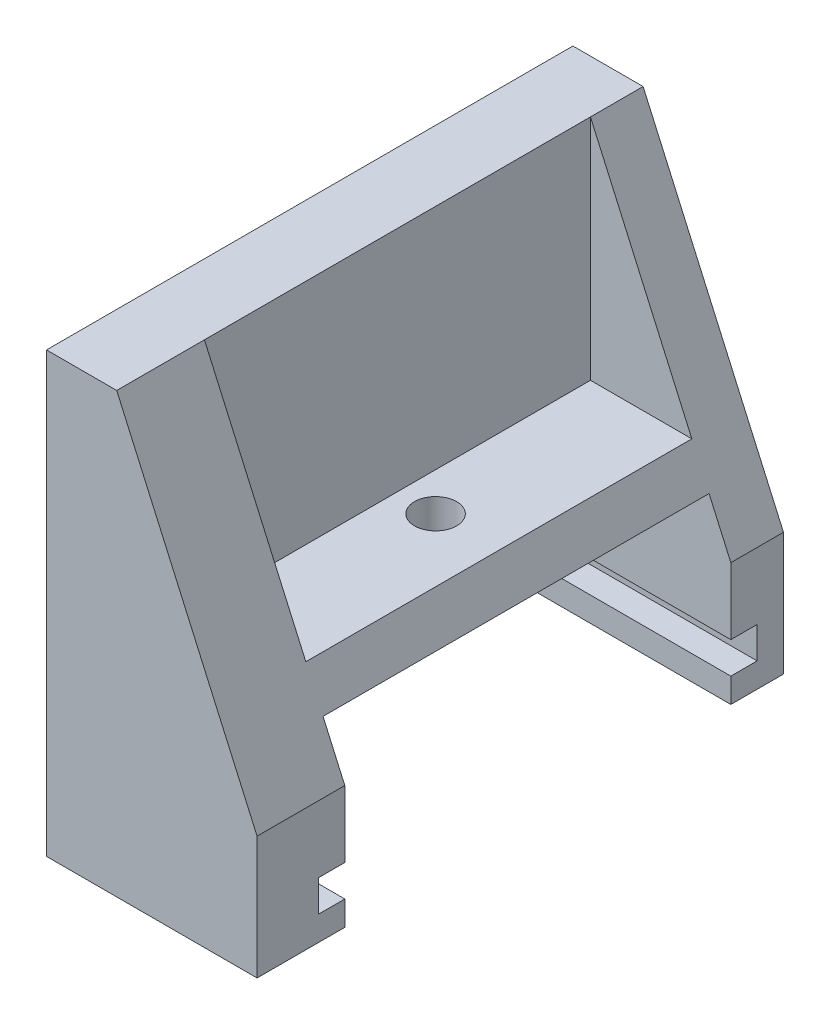
ISO-10303-21;
HEADER;
FILE_DESCRIPTION(('STEP AP214'),'2;1');
FILE_NAME('part.step','',(''),(''),'','','');
FILE_SCHEMA(('AUTOMOTIVE_DESIGN { 1 0 10303 214 1 1 1 1 }'));
ENDSEC;
DATA;
#1=APPLICATION_CONTEXT('core data for automotive mechanical design processes');
#2=APPLICATION_PROTOCOL_DEFINITION('international standard','automotive_design',2000,#1);
#3=PRODUCT_CONTEXT('',#1,'mechanical');
#4=PRODUCT('Part','Part','',(#3));
#5=PRODUCT_RELATED_PRODUCT_CATEGORY('part','',(#4));
#6=PRODUCT_DEFINITION_FORMATION('','',#4);
#7=PRODUCT_DEFINITION_CONTEXT('part definition',#1,'design');
#8=PRODUCT_DEFINITION('design','',#6,#7);
#9=PRODUCT_DEFINITION_SHAPE('','',#8);
#10=(LENGTH_UNIT() NAMED_UNIT(*) SI_UNIT(.MILLI.,.METRE.));
#11=(NAMED_UNIT(*) PLANE_ANGLE_UNIT() SI_UNIT($,.RADIAN.));
#12=(NAMED_UNIT(*) SI_UNIT($,.STERADIAN.) SOLID_ANGLE_UNIT());
#13=UNCERTAINTY_MEASURE_WITH_UNIT(LENGTH_MEASURE(1.E-05),#10,'distance_accuracy_value','');
#14=(GEOMETRIC_REPRESENTATION_CONTEXT(3) GLOBAL_UNCERTAINTY_ASSIGNED_CONTEXT((#13)) GLOBAL_UNIT_ASSIGNED_CONTEXT((#10,
#11,#12)) REPRESENTATION_CONTEXT('',''));
#15=CARTESIAN_POINT('',(0.,0.,0.));
#16=DIRECTION('',(0.,0.,1.));
#17=DIRECTION('',(1.,0.,0.));
#18=AXIS2_PLACEMENT_3D('',#15,#16,#17);
#19=CARTESIAN_POINT('',(12.,-25.,-30.));
#20=DIRECTION('',(1.,0.,0.));
#21=DIRECTION('',(0.,0.,-1.));
#22=AXIS2_PLACEMENT_3D('',#19,#20,#21);
#23=PLANE('',#22);
#24=DIRECTION('',(0.,-1.,0.));
#25=VECTOR('',#24,1.);
#26=CARTESIAN_POINT('',(12.,-25.,-28.5));
#27=LINE('',#26,#25);
#28=CARTESIAN_POINT('',(12.,-21.8,-28.5));
#29=VERTEX_POINT('',#28);
#30=CARTESIAN_POINT('',(12.,-23.6,-28.5));
#31=VERTEX_POINT('',#30);
#32=EDGE_CURVE('E361',#29,#31,#27,.T.);
#33=ORIENTED_EDGE('',*,*,#32,.T.);
#34=DIRECTION('',(0.,0.,1.));
#35=VECTOR('',#34,1.);
#36=CARTESIAN_POINT('',(12.,-23.6,-30.));
#37=LINE('',#36,#35);
#38=CARTESIAN_POINT('',(12.,-23.6,-27.));
#39=VERTEX_POINT('',#38);
#40=EDGE_CURVE('E364',#31,#39,#37,.T.);
#41=ORIENTED_EDGE('',*,*,#40,.T.);
#42=DIRECTION('',(0.,1.,0.));
#43=VECTOR('',#42,1.);
#44=CARTESIAN_POINT('',(12.,-25.,-27.));
#45=LINE('',#44,#43);
#46=CARTESIAN_POINT('',(12.,-25.,-27.));
#47=VERTEX_POINT('',#46);
#48=EDGE_CURVE('E282',#47,#39,#45,.T.);
#49=ORIENTED_EDGE('',*,*,#48,.F.);
#50=DIRECTION('',(0.,0.,1.));
#51=VECTOR('',#50,1.);
#52=CARTESIAN_POINT('',(12.,-25.,-30.));
#53=LINE('',#52,#51);
#54=CARTESIAN_POINT('',(12.,-25.,-30.));
#55=VERTEX_POINT('',#54);
#56=EDGE_CURVE('E224',#55,#47,#53,.T.);
#57=ORIENTED_EDGE('',*,*,#56,.F.);
#58=DIRECTION('',(0.,1.,0.));
#59=VECTOR('',#58,1.);
#60=CARTESIAN_POINT('',(12.,-25.,-30.));
#61=LINE('',#60,#59);
#62=CARTESIAN_POINT('',(12.,-18.,-30.));
#63=VERTEX_POINT('',#62);
#64=EDGE_CURVE('E296',#55,#63,#61,.T.);
#65=ORIENTED_EDGE('',*,*,#64,.T.);
#66=DIRECTION('',(0.,0.,1.));
#67=VECTOR('',#66,1.);
#68=CARTESIAN_POINT('',(12.,-18.,-30.));
#69=LINE('',#68,#67);
#70=CARTESIAN_POINT('',(12.,-18.,-27.));
#71=VERTEX_POINT('',#70);
#72=EDGE_CURVE('E216',#63,#71,#69,.T.);
#73=ORIENTED_EDGE('',*,*,#72,.T.);
#74=CARTESIAN_POINT('',(12.,-21.8,-27.));
#75=VERTEX_POINT('',#74);
#76=EDGE_CURVE('E281',#75,#71,#45,.T.);
#77=ORIENTED_EDGE('',*,*,#76,.F.);
#78=DIRECTION('',(0.,0.,-1.));
#79=VECTOR('',#78,1.);
#80=CARTESIAN_POINT('',(12.,-21.8,-30.));
#81=LINE('',#80,#79);
#82=EDGE_CURVE('E60',#75,#29,#81,.T.);
#83=ORIENTED_EDGE('',*,*,#82,.T.);
#84=EDGE_LOOP('',(#33,#41,#49,#57,#65,#73,#77,#83));
#85=FACE_BOUND('',#84,.T.);
#86=ADVANCED_FACE('F37',(#85),#23,.T.);
#87=CARTESIAN_POINT('',(0.,0.,-30.));
#88=DIRECTION('',(-1.,0.,0.));
#89=DIRECTION('',(0.,0.,1.));
#90=AXIS2_PLACEMENT_3D('',#87,#88,#89);
#91=PLANE('',#90);
#92=DIRECTION('',(0.,-1.,0.));
#93=VECTOR('',#92,1.);
#94=CARTESIAN_POINT('',(0.,-15.2079971845944,-27.));
#95=LINE('',#94,#93);
#96=CARTESIAN_POINT('',(0.,-23.6,-27.));
#97=VERTEX_POINT('',#96);
#98=CARTESIAN_POINT('',(0.,-25.,-27.));
#99=VERTEX_POINT('',#98);
#100=EDGE_CURVE('E258',#97,#99,#95,.T.);
#101=ORIENTED_EDGE('',*,*,#100,.F.);
#102=DIRECTION('',(0.,0.,-1.));
#103=VECTOR('',#102,1.);
#104=CARTESIAN_POINT('',(0.,-23.6,-27.));
#105=LINE('',#104,#103);
#106=CARTESIAN_POINT('',(0.,-23.6,-28.5));
#107=VERTEX_POINT('',#106);
#108=EDGE_CURVE('E371',#97,#107,#105,.T.);
#109=ORIENTED_EDGE('',*,*,#108,.T.);
#110=DIRECTION('',(0.,1.,0.));
#111=VECTOR('',#110,1.);
#112=CARTESIAN_POINT('',(0.,-21.8,-28.5));
#113=LINE('',#112,#111);
#114=CARTESIAN_POINT('',(0.,-21.8,-28.5));
#115=VERTEX_POINT('',#114);
#116=EDGE_CURVE('E250',#107,#115,#113,.T.);
#117=ORIENTED_EDGE('',*,*,#116,.T.);
#118=DIRECTION('',(0.,0.,1.));
#119=VECTOR('',#118,1.);
#120=CARTESIAN_POINT('',(0.,-21.8,-27.));
#121=LINE('',#120,#119);
#122=CARTESIAN_POINT('',(0.,-21.8,-27.));
#123=VERTEX_POINT('',#122);
#124=EDGE_CURVE('E237',#115,#123,#121,.T.);
#125=ORIENTED_EDGE('',*,*,#124,.T.);
#126=CARTESIAN_POINT('',(0.,-15.2079971845944,-27.));
#127=VERTEX_POINT('',#126);
#128=EDGE_CURVE('E247',#127,#123,#95,.T.);
#129=ORIENTED_EDGE('',*,*,#128,.F.);
#130=DIRECTION('',(0.,0.,1.));
#131=VECTOR('',#130,1.);
#132=CARTESIAN_POINT('',(0.,-15.2079971845944,-27.));
#133=LINE('',#132,#131);
#134=CARTESIAN_POINT('',(0.,-15.2079971845944,-5.));
#135=VERTEX_POINT('',#134);
#136=EDGE_CURVE('E261',#127,#135,#133,.T.);
#137=ORIENTED_EDGE('',*,*,#136,.T.);
#138=DIRECTION('',(0.,-1.,0.));
#139=VECTOR('',#138,1.);
#140=CARTESIAN_POINT('',(0.,-15.2079971845944,-5.));
#141=LINE('',#140,#139);
#142=CARTESIAN_POINT('',(0.,-21.8,-5.));
#143=VERTEX_POINT('',#142);
#144=EDGE_CURVE('E340',#135,#143,#141,.T.);
#145=ORIENTED_EDGE('',*,*,#144,.T.);
#146=DIRECTION('',(0.,0.,-1.));
#147=VECTOR('',#146,1.);
#148=CARTESIAN_POINT('',(0.,-21.8,-5.));
#149=LINE('',#148,#147);
#150=CARTESIAN_POINT('',(0.,-21.8,-3.5));
#151=VERTEX_POINT('',#150);
#152=EDGE_CURVE('E352',#151,#143,#149,.T.);
#153=ORIENTED_EDGE('',*,*,#152,.F.);
#154=DIRECTION('',(0.,1.,0.));
#155=VECTOR('',#154,1.);
#156=CARTESIAN_POINT('',(0.,-21.8,-3.5));
#157=LINE('',#156,#155);
#158=CARTESIAN_POINT('',(0.,-23.6,-3.5));
#159=VERTEX_POINT('',#158);
#160=EDGE_CURVE('E355',#159,#151,#157,.T.);
#161=ORIENTED_EDGE('',*,*,#160,.F.);
#162=DIRECTION('',(0.,0.,1.));
#163=VECTOR('',#162,1.);
#164=CARTESIAN_POINT('',(0.,-23.6,-5.));
#165=LINE('',#164,#163);
#166=CARTESIAN_POINT('',(0.,-23.6,-5.));
#167=VERTEX_POINT('',#166);
#168=EDGE_CURVE('E358',#167,#159,#165,.T.);
#169=ORIENTED_EDGE('',*,*,#168,.F.);
#170=CARTESIAN_POINT('',(0.,-25.,-5.));
#171=VERTEX_POINT('',#170);
#172=EDGE_CURVE('E341',#167,#171,#141,.T.);
#173=ORIENTED_EDGE('',*,*,#172,.T.);
#174=DIRECTION('',(0.,0.,1.));
#175=VECTOR('',#174,1.);
#176=CARTESIAN_POINT('',(0.,-25.,-30.));
#177=LINE('',#176,#175);
#178=CARTESIAN_POINT('',(0.,-25.,0.));
#179=VERTEX_POINT('',#178);
#180=EDGE_CURVE('E231',#171,#179,#177,.T.);
#181=ORIENTED_EDGE('',*,*,#180,.T.);
#182=DIRECTION('',(0.,-1.,0.));
#183=VECTOR('',#182,1.);
#184=CARTESIAN_POINT('',(0.,0.,0.));
#185=LINE('',#184,#183);
#186=CARTESIAN_POINT('',(0.,0.,0.));
#187=VERTEX_POINT('',#186);
#188=EDGE_CURVE('E302',#187,#179,#185,.T.);
#189=ORIENTED_EDGE('',*,*,#188,.F.);
#190=DIRECTION('',(0.,0.,1.));
#191=VECTOR('',#190,1.);
#192=CARTESIAN_POINT('',(0.,0.,-30.));
#193=LINE('',#192,#191);
#194=CARTESIAN_POINT('',(0.,0.,-30.));
#195=VERTEX_POINT('',#194);
#196=EDGE_CURVE('E232',#195,#187,#193,.T.);
#197=ORIENTED_EDGE('',*,*,#196,.F.);
#198=DIRECTION('',(0.,-1.,0.));
#199=VECTOR('',#198,1.);
#200=CARTESIAN_POINT('',(0.,0.,-30.));
#201=LINE('',#200,#199);
#202=CARTESIAN_POINT('',(0.,-25.,-30.));
#203=VERTEX_POINT('',#202);
#204=EDGE_CURVE('E290',#195,#203,#201,.T.);
#205=ORIENTED_EDGE('',*,*,#204,.T.);
#206=EDGE_CURVE('E228',#203,#99,#177,.T.);
#207=ORIENTED_EDGE('',*,*,#206,.T.);
#208=EDGE_LOOP('',(#101,#109,#117,#125,#129,#137,#145,#153,#161,#169,#173,#181,#189,#197,#205,#207));
#209=FACE_BOUND('',#208,.T.);
#210=ADVANCED_FACE('F245',(#209),#91,.T.);
#211=CARTESIAN_POINT('',(15.,-15.2079971845944,-27.));
#212=DIRECTION('',(0.,0.,-1.));
#213=DIRECTION('',(0.,1.,0.));
#214=AXIS2_PLACEMENT_3D('',#211,#212,#213);
#215=PLANE('',#214);
#216=DIRECTION('',(1.,0.,0.));
#217=VECTOR('',#216,1.);
#218=CARTESIAN_POINT('',(15.,-23.6,-27.));
#219=LINE('',#218,#217);
#220=EDGE_CURVE('E11',#97,#39,#219,.T.);
#221=ORIENTED_EDGE('',*,*,#220,.F.);
#222=ORIENTED_EDGE('',*,*,#100,.T.);
#223=DIRECTION('',(1.,0.,0.));
#224=VECTOR('',#223,1.);
#225=CARTESIAN_POINT('',(0.,-25.,-27.));
#226=LINE('',#225,#224);
#227=EDGE_CURVE('E279',#99,#47,#226,.T.);
#228=ORIENTED_EDGE('',*,*,#227,.T.);
#229=ORIENTED_EDGE('',*,*,#48,.T.);
#230=EDGE_LOOP('',(#221,#222,#228,#229));
#231=FACE_BOUND('',#230,.T.);
#232=ADVANCED_FACE('F411',(#231),#215,.F.);
#233=DIRECTION('',(-1.,0.,0.));
#234=VECTOR('',#233,1.);
#235=CARTESIAN_POINT('',(15.,-21.8,-27.));
#236=LINE('',#235,#234);
#237=EDGE_CURVE('E45',#75,#123,#236,.T.);
#238=ORIENTED_EDGE('',*,*,#237,.F.);
#239=ORIENTED_EDGE('',*,*,#76,.T.);
#240=DIRECTION('',(-0.406138466053448,0.913811548620257,0.));
#241=VECTOR('',#240,1.);
#242=CARTESIAN_POINT('',(12.,-18.,-27.));
#243=LINE('',#242,#241);
#244=CARTESIAN_POINT('',(10.7591098598198,-15.2079971845944,-27.));
#245=VERTEX_POINT('',#244);
#246=EDGE_CURVE('E285',#71,#245,#243,.T.);
#247=ORIENTED_EDGE('',*,*,#246,.T.);
#248=DIRECTION('',(-1.,0.,0.));
#249=VECTOR('',#248,1.);
#250=CARTESIAN_POINT('',(15.,-15.2079971845944,-27.));
#251=LINE('',#250,#249);
#252=EDGE_CURVE('E255',#245,#127,#251,.T.);
#253=ORIENTED_EDGE('',*,*,#252,.T.);
#254=ORIENTED_EDGE('',*,*,#128,.T.);
#255=EDGE_LOOP('',(#238,#239,#247,#253,#254));
#256=FACE_BOUND('',#255,.T.);
#257=ADVANCED_FACE('F253',(#256),#215,.F.);
#258=CARTESIAN_POINT('',(15.,-15.2079971845944,-5.));
#259=DIRECTION('',(0.,0.,-1.));
#260=DIRECTION('',(-1.,0.,0.));
#261=AXIS2_PLACEMENT_3D('',#258,#259,#260);
#262=PLANE('',#261);
#263=DIRECTION('',(1.,0.,0.));
#264=VECTOR('',#263,1.);
#265=CARTESIAN_POINT('',(15.,-21.8,-5.));
#266=LINE('',#265,#264);
#267=CARTESIAN_POINT('',(12.,-21.8,-5.));
#268=VERTEX_POINT('',#267);
#269=EDGE_CURVE('E214',#143,#268,#266,.T.);
#270=ORIENTED_EDGE('',*,*,#269,.F.);
#271=ORIENTED_EDGE('',*,*,#144,.F.);
#272=DIRECTION('',(-1.,0.,0.));
#273=VECTOR('',#272,1.);
#274=CARTESIAN_POINT('',(15.,-15.2079971845944,-5.));
#275=LINE('',#274,#273);
#276=CARTESIAN_POINT('',(10.7591098598198,-15.2079971845944,-5.));
#277=VERTEX_POINT('',#276);
#278=EDGE_CURVE('E257',#277,#135,#275,.T.);
#279=ORIENTED_EDGE('',*,*,#278,.F.);
#280=DIRECTION('',(-0.406138466053448,0.913811548620257,0.));
#281=VECTOR('',#280,1.);
#282=CARTESIAN_POINT('',(12.,-18.,-5.));
#283=LINE('',#282,#281);
#284=CARTESIAN_POINT('',(12.,-18.,-5.));
#285=VERTEX_POINT('',#284);
#286=EDGE_CURVE('E273',#285,#277,#283,.T.);
#287=ORIENTED_EDGE('',*,*,#286,.F.);
#288=DIRECTION('',(0.,1.,0.));
#289=VECTOR('',#288,1.);
#290=CARTESIAN_POINT('',(12.,-25.,-5.));
#291=LINE('',#290,#289);
#292=EDGE_CURVE('E269',#268,#285,#291,.T.);
#293=ORIENTED_EDGE('',*,*,#292,.F.);
#294=EDGE_LOOP('',(#270,#271,#279,#287,#293));
#295=FACE_BOUND('',#294,.T.);
#296=ADVANCED_FACE('F334',(#295),#262,.T.);
#297=DIRECTION('',(0.,0.,1.));
#298=VECTOR('',#297,1.);
#299=CARTESIAN_POINT('',(12.,-21.8,-30.));
#300=LINE('',#299,#298);
#301=CARTESIAN_POINT('',(12.,-21.8,-3.5));
#302=VERTEX_POINT('',#301);
#303=EDGE_CURVE('E330',#268,#302,#300,.T.);
#304=ORIENTED_EDGE('',*,*,#303,.F.);
#305=ORIENTED_EDGE('',*,*,#292,.T.);
#306=CARTESIAN_POINT('',(12.,-18.,0.));
#307=VERTEX_POINT('',#306);
#308=EDGE_CURVE('E223',#285,#307,#69,.T.);
#309=ORIENTED_EDGE('',*,*,#308,.T.);
#310=DIRECTION('',(0.,1.,0.));
#311=VECTOR('',#310,1.);
#312=CARTESIAN_POINT('',(12.,-25.,0.));
#313=LINE('',#312,#311);
#314=CARTESIAN_POINT('',(12.,-25.,0.));
#315=VERTEX_POINT('',#314);
#316=EDGE_CURVE('E307',#315,#307,#313,.T.);
#317=ORIENTED_EDGE('',*,*,#316,.F.);
#318=CARTESIAN_POINT('',(12.,-25.,-5.));
#319=VERTEX_POINT('',#318);
#320=EDGE_CURVE('E227',#319,#315,#53,.T.);
#321=ORIENTED_EDGE('',*,*,#320,.F.);
#322=CARTESIAN_POINT('',(12.,-23.6,-5.));
#323=VERTEX_POINT('',#322);
#324=EDGE_CURVE('E270',#319,#323,#291,.T.);
#325=ORIENTED_EDGE('',*,*,#324,.T.);
#326=DIRECTION('',(0.,0.,-1.));
#327=VECTOR('',#326,1.);
#328=CARTESIAN_POINT('',(12.,-23.6,-30.));
#329=LINE('',#328,#327);
#330=CARTESIAN_POINT('',(12.,-23.6,-3.5));
#331=VERTEX_POINT('',#330);
#332=EDGE_CURVE('E347',#331,#323,#329,.T.);
#333=ORIENTED_EDGE('',*,*,#332,.F.);
#334=DIRECTION('',(0.,-1.,0.));
#335=VECTOR('',#334,1.);
#336=CARTESIAN_POINT('',(12.,-25.,-3.5));
#337=LINE('',#336,#335);
#338=EDGE_CURVE('E343',#302,#331,#337,.T.);
#339=ORIENTED_EDGE('',*,*,#338,.F.);
#340=EDGE_LOOP('',(#304,#305,#309,#317,#321,#325,#333,#339));
#341=FACE_BOUND('',#340,.T.);
#342=ADVANCED_FACE('F326',(#341),#23,.T.);
#343=CARTESIAN_POINT('',(0.,-25.,-30.));
#344=DIRECTION('',(0.,-1.,0.));
#345=DIRECTION('',(0.,0.,-1.));
#346=AXIS2_PLACEMENT_3D('',#343,#344,#345);
#347=PLANE('',#346);
#348=ORIENTED_EDGE('',*,*,#180,.F.);
#349=DIRECTION('',(1.,0.,0.));
#350=VECTOR('',#349,1.);
#351=CARTESIAN_POINT('',(0.,-25.,-5.));
#352=LINE('',#351,#350);
#353=EDGE_CURVE('E265',#171,#319,#352,.T.);
#354=ORIENTED_EDGE('',*,*,#353,.T.);
#355=ORIENTED_EDGE('',*,*,#320,.T.);
#356=DIRECTION('',(1.,0.,0.));
#357=VECTOR('',#356,1.);
#358=CARTESIAN_POINT('',(0.,-25.,0.));
#359=LINE('',#358,#357);
#360=EDGE_CURVE('E305',#179,#315,#359,.T.);
#361=ORIENTED_EDGE('',*,*,#360,.F.);
#362=EDGE_LOOP('',(#348,#354,#355,#361));
#363=FACE_BOUND('',#362,.T.);
#364=ADVANCED_FACE('F321',(#363),#347,.T.);
#365=CARTESIAN_POINT('',(4.,0.,-30.));
#366=DIRECTION('',(0.,1.,0.));
#367=DIRECTION('',(-1.,0.,0.));
#368=AXIS2_PLACEMENT_3D('',#365,#366,#367);
#369=PLANE('',#368);
#370=DIRECTION('',(-1.,0.,0.));
#371=VECTOR('',#370,1.);
#372=CARTESIAN_POINT('',(4.,0.,0.));
#373=LINE('',#372,#371);
#374=CARTESIAN_POINT('',(4.,0.,0.));
#375=VERTEX_POINT('',#374);
#376=EDGE_CURVE('E287',#375,#187,#373,.T.);
#377=ORIENTED_EDGE('',*,*,#376,.F.);
#378=DIRECTION('',(0.,0.,1.));
#379=VECTOR('',#378,1.);
#380=CARTESIAN_POINT('',(4.,0.,-30.));
#381=LINE('',#380,#379);
#382=CARTESIAN_POINT('',(4.,0.,-5.));
#383=VERTEX_POINT('',#382);
#384=EDGE_CURVE('E206',#383,#375,#381,.T.);
#385=ORIENTED_EDGE('',*,*,#384,.F.);
#386=DIRECTION('',(0.,0.,1.));
#387=VECTOR('',#386,1.);
#388=CARTESIAN_POINT('',(4.,0.,-27.));
#389=LINE('',#388,#387);
#390=CARTESIAN_POINT('',(4.,0.,-27.));
#391=VERTEX_POINT('',#390);
#392=EDGE_CURVE('E184',#391,#383,#389,.T.);
#393=ORIENTED_EDGE('',*,*,#392,.F.);
#394=CARTESIAN_POINT('',(4.,0.,-30.));
#395=VERTEX_POINT('',#394);
#396=EDGE_CURVE('E204',#395,#391,#381,.T.);
#397=ORIENTED_EDGE('',*,*,#396,.F.);
#398=DIRECTION('',(-1.,0.,0.));
#399=VECTOR('',#398,1.);
#400=CARTESIAN_POINT('',(4.,0.,-30.));
#401=LINE('',#400,#399);
#402=EDGE_CURVE('E288',#395,#195,#401,.T.);
#403=ORIENTED_EDGE('',*,*,#402,.T.);
#404=ORIENTED_EDGE('',*,*,#196,.T.);
#405=EDGE_LOOP('',(#377,#385,#393,#397,#403,#404));
#406=FACE_BOUND('',#405,.T.);
#407=ADVANCED_FACE('F39',(#406),#369,.T.);
#408=CARTESIAN_POINT('',(12.,-18.,-30.));
#409=DIRECTION('',(0.913811548620257,0.406138466053448,0.));
#410=DIRECTION('',(-0.406138466053448,0.913811548620257,0.));
#411=AXIS2_PLACEMENT_3D('',#408,#409,#410);
#412=PLANE('',#411);
#413=DIRECTION('',(-0.406138466053448,0.913811548620257,0.));
#414=VECTOR('',#413,1.);
#415=CARTESIAN_POINT('',(9.77777777777778,-13.,-27.));
#416=LINE('',#415,#414);
#417=CARTESIAN_POINT('',(9.77777777777778,-13.,-27.));
#418=VERTEX_POINT('',#417);
#419=EDGE_CURVE('E191',#418,#391,#416,.T.);
#420=ORIENTED_EDGE('',*,*,#419,.F.);
#421=DIRECTION('',(0.,0.,1.));
#422=VECTOR('',#421,1.);
#423=CARTESIAN_POINT('',(9.77777777777778,-13.,-27.));
#424=LINE('',#423,#422);
#425=CARTESIAN_POINT('',(9.77777777777778,-13.,-5.));
#426=VERTEX_POINT('',#425);
#427=EDGE_CURVE('E251',#418,#426,#424,.T.);
#428=ORIENTED_EDGE('',*,*,#427,.T.);
#429=DIRECTION('',(-0.406138466053448,0.913811548620257,0.));
#430=VECTOR('',#429,1.);
#431=CARTESIAN_POINT('',(9.77777777777778,-13.,-5.));
#432=LINE('',#431,#430);
#433=EDGE_CURVE('E315',#426,#383,#432,.T.);
#434=ORIENTED_EDGE('',*,*,#433,.T.);
#435=ORIENTED_EDGE('',*,*,#384,.T.);
#436=DIRECTION('',(-0.406138466053448,0.913811548620257,0.));
#437=VECTOR('',#436,1.);
#438=CARTESIAN_POINT('',(12.,-18.,0.));
#439=LINE('',#438,#437);
#440=EDGE_CURVE('E219',#307,#375,#439,.T.);
#441=ORIENTED_EDGE('',*,*,#440,.F.);
#442=ORIENTED_EDGE('',*,*,#308,.F.);
#443=ORIENTED_EDGE('',*,*,#286,.T.);
#444=DIRECTION('',(0.,0.,-1.));
#445=VECTOR('',#444,1.);
#446=CARTESIAN_POINT('',(10.7591098598198,-15.2079971845944,-30.));
#447=LINE('',#446,#445);
#448=EDGE_CURVE('E276',#277,#245,#447,.T.);
#449=ORIENTED_EDGE('',*,*,#448,.T.);
#450=ORIENTED_EDGE('',*,*,#246,.F.);
#451=ORIENTED_EDGE('',*,*,#72,.F.);
#452=DIRECTION('',(-0.406138466053448,0.913811548620257,0.));
#453=VECTOR('',#452,1.);
#454=CARTESIAN_POINT('',(12.,-18.,-30.));
#455=LINE('',#454,#453);
#456=EDGE_CURVE('E211',#63,#395,#455,.T.);
#457=ORIENTED_EDGE('',*,*,#456,.T.);
#458=ORIENTED_EDGE('',*,*,#396,.T.);
#459=EDGE_LOOP('',(#420,#428,#434,#435,#441,#442,#443,#449,#450,#451,#457,#458));
#460=FACE_BOUND('',#459,.T.);
#461=ADVANCED_FACE('F209',(#460),#412,.T.);
#462=ORIENTED_EDGE('',*,*,#227,.F.);
#463=ORIENTED_EDGE('',*,*,#206,.F.);
#464=DIRECTION('',(1.,0.,0.));
#465=VECTOR('',#464,1.);
#466=CARTESIAN_POINT('',(0.,-25.,-30.));
#467=LINE('',#466,#465);
#468=EDGE_CURVE('E293',#203,#55,#467,.T.);
#469=ORIENTED_EDGE('',*,*,#468,.T.);
#470=ORIENTED_EDGE('',*,*,#56,.T.);
#471=EDGE_LOOP('',(#462,#463,#469,#470));
#472=FACE_BOUND('',#471,.T.);
#473=ADVANCED_FACE('F419',(#472),#347,.T.);
#474=CARTESIAN_POINT('',(0.,0.,-30.));
#475=DIRECTION('',(0.,0.,1.));
#476=DIRECTION('',(1.,0.,0.));
#477=AXIS2_PLACEMENT_3D('',#474,#475,#476);
#478=PLANE('',#477);
#479=ORIENTED_EDGE('',*,*,#402,.F.);
#480=ORIENTED_EDGE('',*,*,#456,.F.);
#481=ORIENTED_EDGE('',*,*,#64,.F.);
#482=ORIENTED_EDGE('',*,*,#468,.F.);
#483=ORIENTED_EDGE('',*,*,#204,.F.);
#484=EDGE_LOOP('',(#479,#480,#481,#482,#483));
#485=FACE_BOUND('',#484,.T.);
#486=ADVANCED_FACE('F469',(#485),#478,.F.);
#487=CARTESIAN_POINT('',(0.,0.,0.));
#488=DIRECTION('',(0.,0.,1.));
#489=DIRECTION('',(1.,0.,0.));
#490=AXIS2_PLACEMENT_3D('',#487,#488,#489);
#491=PLANE('',#490);
#492=ORIENTED_EDGE('',*,*,#376,.T.);
#493=ORIENTED_EDGE('',*,*,#188,.T.);
#494=ORIENTED_EDGE('',*,*,#360,.T.);
#495=ORIENTED_EDGE('',*,*,#316,.T.);
#496=ORIENTED_EDGE('',*,*,#440,.T.);
#497=EDGE_LOOP('',(#492,#493,#494,#495,#496));
#498=FACE_BOUND('',#497,.T.);
#499=ADVANCED_FACE('F313',(#498),#491,.T.);
#500=CARTESIAN_POINT('',(15.,-15.2079971845944,-27.));
#501=DIRECTION('',(0.,-1.,0.));
#502=DIRECTION('',(0.,0.,-1.));
#503=AXIS2_PLACEMENT_3D('',#500,#501,#502);
#504=PLANE('',#503);
#505=CARTESIAN_POINT('',(6.17275319657275,-15.2079971845944,-16.));
#506=DIRECTION('',(0.,-1.,0.));
#507=DIRECTION('',(0.,0.,-1.));
#508=AXIS2_PLACEMENT_3D('',#505,#506,#507);
#509=CIRCLE('',#508,1.2);
#510=CARTESIAN_POINT('',(6.17275319657275,-15.2079971845944,-17.2));
#511=VERTEX_POINT('',#510);
#512=EDGE_CURVE('E381',#511,#511,#509,.T.);
#513=ORIENTED_EDGE('',*,*,#512,.F.);
#514=EDGE_LOOP('',(#513));
#515=FACE_BOUND('',#514,.T.);
#516=ORIENTED_EDGE('',*,*,#278,.T.);
#517=ORIENTED_EDGE('',*,*,#136,.F.);
#518=ORIENTED_EDGE('',*,*,#252,.F.);
#519=ORIENTED_EDGE('',*,*,#448,.F.);
#520=EDGE_LOOP('',(#516,#517,#518,#519));
#521=FACE_BOUND('',#520,.T.);
#522=ADVANCED_FACE('F338',(#515,#521),#504,.T.);
#523=DIRECTION('',(-1.,0.,0.));
#524=VECTOR('',#523,1.);
#525=CARTESIAN_POINT('',(15.,-23.6,-5.));
#526=LINE('',#525,#524);
#527=EDGE_CURVE('E212',#323,#167,#526,.T.);
#528=ORIENTED_EDGE('',*,*,#527,.F.);
#529=ORIENTED_EDGE('',*,*,#324,.F.);
#530=ORIENTED_EDGE('',*,*,#353,.F.);
#531=ORIENTED_EDGE('',*,*,#172,.F.);
#532=EDGE_LOOP('',(#528,#529,#530,#531));
#533=FACE_BOUND('',#532,.T.);
#534=ADVANCED_FACE('F421',(#533),#262,.T.);
#535=CARTESIAN_POINT('',(15.,-21.8,-5.));
#536=DIRECTION('',(0.,1.,0.));
#537=DIRECTION('',(0.,0.,1.));
#538=AXIS2_PLACEMENT_3D('',#535,#536,#537);
#539=PLANE('',#538);
#540=ORIENTED_EDGE('',*,*,#303,.T.);
#541=DIRECTION('',(-1.,0.,0.));
#542=VECTOR('',#541,1.);
#543=CARTESIAN_POINT('',(15.,-21.8,-3.5));
#544=LINE('',#543,#542);
#545=EDGE_CURVE('E349',#302,#151,#544,.T.);
#546=ORIENTED_EDGE('',*,*,#545,.T.);
#547=ORIENTED_EDGE('',*,*,#152,.T.);
#548=ORIENTED_EDGE('',*,*,#269,.T.);
#549=EDGE_LOOP('',(#540,#546,#547,#548));
#550=FACE_BOUND('',#549,.T.);
#551=ADVANCED_FACE('F429',(#550),#539,.F.);
#552=CARTESIAN_POINT('',(15.,-21.8,-3.5));
#553=DIRECTION('',(0.,0.,1.));
#554=DIRECTION('',(0.,-1.,0.));
#555=AXIS2_PLACEMENT_3D('',#552,#553,#554);
#556=PLANE('',#555);
#557=ORIENTED_EDGE('',*,*,#338,.T.);
#558=DIRECTION('',(-1.,0.,0.));
#559=VECTOR('',#558,1.);
#560=CARTESIAN_POINT('',(15.,-23.6,-3.5));
#561=LINE('',#560,#559);
#562=EDGE_CURVE('E350',#331,#159,#561,.T.);
#563=ORIENTED_EDGE('',*,*,#562,.T.);
#564=ORIENTED_EDGE('',*,*,#160,.T.);
#565=ORIENTED_EDGE('',*,*,#545,.F.);
#566=EDGE_LOOP('',(#557,#563,#564,#565));
#567=FACE_BOUND('',#566,.T.);
#568=ADVANCED_FACE('F435',(#567),#556,.F.);
#569=CARTESIAN_POINT('',(15.,-23.6,-5.));
#570=DIRECTION('',(0.,-1.,0.));
#571=DIRECTION('',(0.,0.,-1.));
#572=AXIS2_PLACEMENT_3D('',#569,#570,#571);
#573=PLANE('',#572);
#574=ORIENTED_EDGE('',*,*,#332,.T.);
#575=ORIENTED_EDGE('',*,*,#527,.T.);
#576=ORIENTED_EDGE('',*,*,#168,.T.);
#577=ORIENTED_EDGE('',*,*,#562,.F.);
#578=EDGE_LOOP('',(#574,#575,#576,#577));
#579=FACE_BOUND('',#578,.T.);
#580=ADVANCED_FACE('F445',(#579),#573,.F.);
#581=CARTESIAN_POINT('',(15.,-23.6,-27.));
#582=DIRECTION('',(0.,1.,0.));
#583=DIRECTION('',(0.,0.,1.));
#584=AXIS2_PLACEMENT_3D('',#581,#582,#583);
#585=PLANE('',#584);
#586=DIRECTION('',(-1.,0.,0.));
#587=VECTOR('',#586,1.);
#588=CARTESIAN_POINT('',(15.,-23.6,-28.5));
#589=LINE('',#588,#587);
#590=EDGE_CURVE('E368',#31,#107,#589,.T.);
#591=ORIENTED_EDGE('',*,*,#590,.T.);
#592=ORIENTED_EDGE('',*,*,#108,.F.);
#593=ORIENTED_EDGE('',*,*,#220,.T.);
#594=ORIENTED_EDGE('',*,*,#40,.F.);
#595=EDGE_LOOP('',(#591,#592,#593,#594));
#596=FACE_BOUND('',#595,.T.);
#597=ADVANCED_FACE('F454',(#596),#585,.T.);
#598=CARTESIAN_POINT('',(15.,-21.8,-28.5));
#599=DIRECTION('',(0.,0.,1.));
#600=DIRECTION('',(0.,-1.,0.));
#601=AXIS2_PLACEMENT_3D('',#598,#599,#600);
#602=PLANE('',#601);
#603=DIRECTION('',(-1.,0.,0.));
#604=VECTOR('',#603,1.);
#605=CARTESIAN_POINT('',(15.,-21.8,-28.5));
#606=LINE('',#605,#604);
#607=EDGE_CURVE('E369',#29,#115,#606,.T.);
#608=ORIENTED_EDGE('',*,*,#607,.T.);
#609=ORIENTED_EDGE('',*,*,#116,.F.);
#610=ORIENTED_EDGE('',*,*,#590,.F.);
#611=ORIENTED_EDGE('',*,*,#32,.F.);
#612=EDGE_LOOP('',(#608,#609,#610,#611));
#613=FACE_BOUND('',#612,.T.);
#614=ADVANCED_FACE('F472',(#613),#602,.T.);
#615=CARTESIAN_POINT('',(15.,-21.8,-27.));
#616=DIRECTION('',(0.,-1.,0.));
#617=DIRECTION('',(0.,0.,-1.));
#618=AXIS2_PLACEMENT_3D('',#615,#616,#617);
#619=PLANE('',#618);
#620=ORIENTED_EDGE('',*,*,#237,.T.);
#621=ORIENTED_EDGE('',*,*,#124,.F.);
#622=ORIENTED_EDGE('',*,*,#607,.F.);
#623=ORIENTED_EDGE('',*,*,#82,.F.);
#624=EDGE_LOOP('',(#620,#621,#622,#623));
#625=FACE_BOUND('',#624,.T.);
#626=ADVANCED_FACE('F236',(#625),#619,.T.);
#627=CARTESIAN_POINT('',(4.,-13.,-27.));
#628=DIRECTION('',(0.,-1.,0.));
#629=DIRECTION('',(0.,0.,-1.));
#630=AXIS2_PLACEMENT_3D('',#627,#628,#629);
#631=PLANE('',#630);
#632=CARTESIAN_POINT('',(6.17275319657275,-13.,-16.));
#633=DIRECTION('',(0.,1.,0.));
#634=DIRECTION('',(0.,0.,1.));
#635=AXIS2_PLACEMENT_3D('',#632,#633,#634);
#636=CIRCLE('',#635,1.2);
#637=CARTESIAN_POINT('',(6.17275319657275,-13.,-14.8));
#638=VERTEX_POINT('',#637);
#639=EDGE_CURVE('E385',#638,#638,#636,.T.);
#640=ORIENTED_EDGE('',*,*,#639,.F.);
#641=EDGE_LOOP('',(#640));
#642=FACE_BOUND('',#641,.T.);
#643=DIRECTION('',(1.,0.,0.));
#644=VECTOR('',#643,1.);
#645=CARTESIAN_POINT('',(4.,-13.,-5.));
#646=LINE('',#645,#644);
#647=CARTESIAN_POINT('',(4.,-13.,-5.));
#648=VERTEX_POINT('',#647);
#649=EDGE_CURVE('E198',#648,#426,#646,.T.);
#650=ORIENTED_EDGE('',*,*,#649,.T.);
#651=ORIENTED_EDGE('',*,*,#427,.F.);
#652=DIRECTION('',(1.,0.,0.));
#653=VECTOR('',#652,1.);
#654=CARTESIAN_POINT('',(4.,-13.,-27.));
#655=LINE('',#654,#653);
#656=CARTESIAN_POINT('',(4.,-13.,-27.));
#657=VERTEX_POINT('',#656);
#658=EDGE_CURVE('E190',#657,#418,#655,.T.);
#659=ORIENTED_EDGE('',*,*,#658,.F.);
#660=DIRECTION('',(0.,0.,1.));
#661=VECTOR('',#660,1.);
#662=CARTESIAN_POINT('',(4.,-13.,-27.));
#663=LINE('',#662,#661);
#664=EDGE_CURVE('E186',#657,#648,#663,.T.);
#665=ORIENTED_EDGE('',*,*,#664,.T.);
#666=EDGE_LOOP('',(#650,#651,#659,#665));
#667=FACE_BOUND('',#666,.T.);
#668=ADVANCED_FACE('F391',(#642,#667),#631,.F.);
#669=CARTESIAN_POINT('',(4.,0.,-27.));
#670=DIRECTION('',(-1.,0.,0.));
#671=DIRECTION('',(0.,-1.,0.));
#672=AXIS2_PLACEMENT_3D('',#669,#670,#671);
#673=PLANE('',#672);
#674=DIRECTION('',(0.,-1.,0.));
#675=VECTOR('',#674,1.);
#676=CARTESIAN_POINT('',(4.,0.,-5.));
#677=LINE('',#676,#675);
#678=EDGE_CURVE('E52',#383,#648,#677,.T.);
#679=ORIENTED_EDGE('',*,*,#678,.T.);
#680=ORIENTED_EDGE('',*,*,#664,.F.);
#681=DIRECTION('',(0.,-1.,0.));
#682=VECTOR('',#681,1.);
#683=CARTESIAN_POINT('',(4.,0.,-27.));
#684=LINE('',#683,#682);
#685=EDGE_CURVE('E180',#391,#657,#684,.T.);
#686=ORIENTED_EDGE('',*,*,#685,.F.);
#687=ORIENTED_EDGE('',*,*,#392,.T.);
#688=EDGE_LOOP('',(#679,#680,#686,#687));
#689=FACE_BOUND('',#688,.T.);
#690=ADVANCED_FACE('F182',(#689),#673,.F.);
#691=CARTESIAN_POINT('',(0.,0.,-27.));
#692=DIRECTION('',(0.,0.,-1.));
#693=DIRECTION('',(-1.,0.,0.));
#694=AXIS2_PLACEMENT_3D('',#691,#692,#693);
#695=PLANE('',#694);
#696=ORIENTED_EDGE('',*,*,#419,.T.);
#697=ORIENTED_EDGE('',*,*,#685,.T.);
#698=ORIENTED_EDGE('',*,*,#658,.T.);
#699=EDGE_LOOP('',(#696,#697,#698));
#700=FACE_BOUND('',#699,.T.);
#701=ADVANCED_FACE('F194',(#700),#695,.F.);
#702=CARTESIAN_POINT('',(0.,0.,-5.));
#703=DIRECTION('',(0.,0.,-1.));
#704=DIRECTION('',(-1.,0.,0.));
#705=AXIS2_PLACEMENT_3D('',#702,#703,#704);
#706=PLANE('',#705);
#707=ORIENTED_EDGE('',*,*,#433,.F.);
#708=ORIENTED_EDGE('',*,*,#649,.F.);
#709=ORIENTED_EDGE('',*,*,#678,.F.);
#710=EDGE_LOOP('',(#707,#708,#709));
#711=FACE_BOUND('',#710,.T.);
#712=ADVANCED_FACE('F395',(#711),#706,.T.);
#713=CARTESIAN_POINT('',(6.17275319657275,-17.,-16.));
#714=DIRECTION('',(0.,1.,0.));
#715=DIRECTION('',(0.,0.,1.));
#716=AXIS2_PLACEMENT_3D('',#713,#714,#715);
#717=CYLINDRICAL_SURFACE('',#716,1.2);
#718=ORIENTED_EDGE('',*,*,#512,.T.);
#719=EDGE_LOOP('',(#718));
#720=FACE_BOUND('',#719,.T.);
#721=ORIENTED_EDGE('',*,*,#639,.T.);
#722=EDGE_LOOP('',(#721));
#723=FACE_BOUND('',#722,.T.);
#724=ADVANCED_FACE('F389',(#720,#723),#717,.F.);
#725=CLOSED_SHELL('',(#86,#210,#232,#257,#296,#342,#364,#407,#461,#473,#486,#499,#522,#534,#551,
#568,#580,#597,#614,#626,#668,#690,#701,#712,#724));
#726=MANIFOLD_SOLID_BREP('B2',#725);
#727=ADVANCED_BREP_SHAPE_REPRESENTATION('',(#18,#726),#14);
#728=SHAPE_DEFINITION_REPRESENTATION(#9,#727);
ENDSEC;
END-ISO-10303-21;
